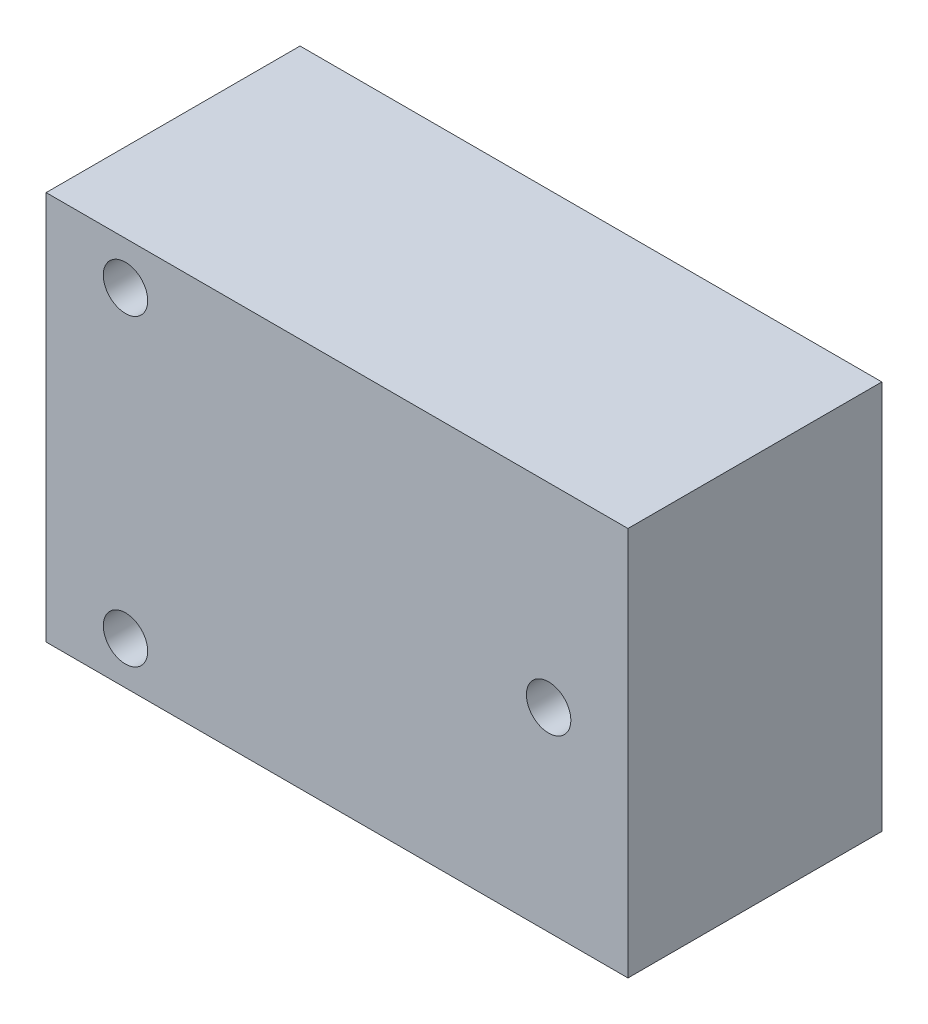
ISO-10303-21;
HEADER;
FILE_DESCRIPTION(('STEP AP214'),'2;1');
FILE_NAME('part.step','',(''),(''),'','','');
FILE_SCHEMA(('AUTOMOTIVE_DESIGN { 1 0 10303 214 1 1 1 1 }'));
ENDSEC;
DATA;
#1=APPLICATION_CONTEXT('core data for automotive mechanical design processes');
#2=APPLICATION_PROTOCOL_DEFINITION('international standard','automotive_design',2000,#1);
#3=PRODUCT_CONTEXT('',#1,'mechanical');
#4=PRODUCT('Part','Part','',(#3));
#5=PRODUCT_RELATED_PRODUCT_CATEGORY('part','',(#4));
#6=PRODUCT_DEFINITION_FORMATION('','',#4);
#7=PRODUCT_DEFINITION_CONTEXT('part definition',#1,'design');
#8=PRODUCT_DEFINITION('design','',#6,#7);
#9=PRODUCT_DEFINITION_SHAPE('','',#8);
#10=(LENGTH_UNIT() NAMED_UNIT(*) SI_UNIT(.MILLI.,.METRE.));
#11=(NAMED_UNIT(*) PLANE_ANGLE_UNIT() SI_UNIT($,.RADIAN.));
#12=(NAMED_UNIT(*) SI_UNIT($,.STERADIAN.) SOLID_ANGLE_UNIT());
#13=UNCERTAINTY_MEASURE_WITH_UNIT(LENGTH_MEASURE(1.E-05),#10,'distance_accuracy_value','');
#14=(GEOMETRIC_REPRESENTATION_CONTEXT(3) GLOBAL_UNCERTAINTY_ASSIGNED_CONTEXT((#13)) GLOBAL_UNIT_ASSIGNED_CONTEXT((#10,
#11,#12)) REPRESENTATION_CONTEXT('',''));
#15=CARTESIAN_POINT('',(0.,0.,0.));
#16=DIRECTION('',(0.,0.,1.));
#17=DIRECTION('',(1.,0.,0.));
#18=AXIS2_PLACEMENT_3D('',#15,#16,#17);
#19=CARTESIAN_POINT('',(0.,0.,24.));
#20=DIRECTION('',(0.,0.,-1.));
#21=DIRECTION('',(-1.,0.,0.));
#22=AXIS2_PLACEMENT_3D('',#19,#20,#21);
#23=PLANE('',#22);
#24=DIRECTION('',(0.,-1.,0.));
#25=VECTOR('',#24,1.);
#26=CARTESIAN_POINT('',(-27.5,18.4,24.));
#27=LINE('',#26,#25);
#28=CARTESIAN_POINT('',(-27.5,18.4,24.));
#29=VERTEX_POINT('',#28);
#30=CARTESIAN_POINT('',(-27.5,-18.4,24.));
#31=VERTEX_POINT('',#30);
#32=EDGE_CURVE('E92',#29,#31,#27,.T.);
#33=ORIENTED_EDGE('',*,*,#32,.T.);
#34=DIRECTION('',(1.,0.,0.));
#35=VECTOR('',#34,1.);
#36=CARTESIAN_POINT('',(27.5,-18.4,24.));
#37=LINE('',#36,#35);
#38=CARTESIAN_POINT('',(27.5,-18.4,24.));
#39=VERTEX_POINT('',#38);
#40=EDGE_CURVE('E87',#31,#39,#37,.T.);
#41=ORIENTED_EDGE('',*,*,#40,.T.);
#42=DIRECTION('',(0.,1.,0.));
#43=VECTOR('',#42,1.);
#44=CARTESIAN_POINT('',(27.5,18.4,24.));
#45=LINE('',#44,#43);
#46=CARTESIAN_POINT('',(27.5,18.4,24.));
#47=VERTEX_POINT('',#46);
#48=EDGE_CURVE('E90',#39,#47,#45,.T.);
#49=ORIENTED_EDGE('',*,*,#48,.T.);
#50=DIRECTION('',(-1.,0.,0.));
#51=VECTOR('',#50,1.);
#52=CARTESIAN_POINT('',(27.5,18.4,24.));
#53=LINE('',#52,#51);
#54=EDGE_CURVE('E57',#47,#29,#53,.T.);
#55=ORIENTED_EDGE('',*,*,#54,.T.);
#56=EDGE_LOOP('',(#33,#41,#49,#55));
#57=FACE_BOUND('',#56,.T.);
#58=CARTESIAN_POINT('',(-20.,14.35,24.));
#59=DIRECTION('',(0.,0.,1.));
#60=DIRECTION('',(1.,0.,0.));
#61=AXIS2_PLACEMENT_3D('',#58,#59,#60);
#62=CIRCLE('',#61,2.1);
#63=CARTESIAN_POINT('',(-17.9,14.35,24.));
#64=VERTEX_POINT('',#63);
#65=EDGE_CURVE('E112',#64,#64,#62,.T.);
#66=ORIENTED_EDGE('',*,*,#65,.F.);
#67=EDGE_LOOP('',(#66));
#68=FACE_BOUND('',#67,.T.);
#69=CARTESIAN_POINT('',(20.,0.,24.));
#70=DIRECTION('',(0.,0.,1.));
#71=DIRECTION('',(1.,0.,0.));
#72=AXIS2_PLACEMENT_3D('',#69,#70,#71);
#73=CIRCLE('',#72,2.1);
#74=CARTESIAN_POINT('',(22.1,0.,24.));
#75=VERTEX_POINT('',#74);
#76=EDGE_CURVE('E134',#75,#75,#73,.T.);
#77=ORIENTED_EDGE('',*,*,#76,.F.);
#78=EDGE_LOOP('',(#77));
#79=FACE_BOUND('',#78,.T.);
#80=CARTESIAN_POINT('',(-20.,-14.35,24.));
#81=DIRECTION('',(0.,0.,1.));
#82=DIRECTION('',(-1.,0.,0.));
#83=AXIS2_PLACEMENT_3D('',#80,#81,#82);
#84=CIRCLE('',#83,2.1);
#85=CARTESIAN_POINT('',(-22.1,-14.35,24.));
#86=VERTEX_POINT('',#85);
#87=EDGE_CURVE('E142',#86,#86,#84,.T.);
#88=ORIENTED_EDGE('',*,*,#87,.F.);
#89=EDGE_LOOP('',(#88));
#90=FACE_BOUND('',#89,.T.);
#91=ADVANCED_FACE('F39',(#57,#68,#79,#90),#23,.F.);
#92=CARTESIAN_POINT('',(0.,0.,0.));
#93=DIRECTION('',(0.,0.,-1.));
#94=DIRECTION('',(-1.,0.,0.));
#95=AXIS2_PLACEMENT_3D('',#92,#93,#94);
#96=PLANE('',#95);
#97=CARTESIAN_POINT('',(20.,0.,0.));
#98=DIRECTION('',(0.,0.,1.));
#99=DIRECTION('',(1.,0.,0.));
#100=AXIS2_PLACEMENT_3D('',#97,#98,#99);
#101=CIRCLE('',#100,2.1);
#102=CARTESIAN_POINT('',(22.1,0.,0.));
#103=VERTEX_POINT('',#102);
#104=EDGE_CURVE('E138',#103,#103,#101,.T.);
#105=ORIENTED_EDGE('',*,*,#104,.T.);
#106=EDGE_LOOP('',(#105));
#107=FACE_BOUND('',#106,.T.);
#108=DIRECTION('',(0.,-1.,0.));
#109=VECTOR('',#108,1.);
#110=CARTESIAN_POINT('',(-27.5,18.4,0.));
#111=LINE('',#110,#109);
#112=CARTESIAN_POINT('',(-27.5,18.4,0.));
#113=VERTEX_POINT('',#112);
#114=CARTESIAN_POINT('',(-27.5,-18.4,0.));
#115=VERTEX_POINT('',#114);
#116=EDGE_CURVE('E108',#113,#115,#111,.T.);
#117=ORIENTED_EDGE('',*,*,#116,.F.);
#118=DIRECTION('',(-1.,0.,0.));
#119=VECTOR('',#118,1.);
#120=CARTESIAN_POINT('',(27.5,18.4,0.));
#121=LINE('',#120,#119);
#122=CARTESIAN_POINT('',(27.5,18.4,0.));
#123=VERTEX_POINT('',#122);
#124=EDGE_CURVE('E80',#123,#113,#121,.T.);
#125=ORIENTED_EDGE('',*,*,#124,.F.);
#126=DIRECTION('',(0.,1.,0.));
#127=VECTOR('',#126,1.);
#128=CARTESIAN_POINT('',(27.5,18.4,0.));
#129=LINE('',#128,#127);
#130=CARTESIAN_POINT('',(27.5,-18.4,0.));
#131=VERTEX_POINT('',#130);
#132=EDGE_CURVE('E74',#131,#123,#129,.T.);
#133=ORIENTED_EDGE('',*,*,#132,.F.);
#134=DIRECTION('',(1.,0.,0.));
#135=VECTOR('',#134,1.);
#136=CARTESIAN_POINT('',(27.5,-18.4,0.));
#137=LINE('',#136,#135);
#138=EDGE_CURVE('E97',#115,#131,#137,.T.);
#139=ORIENTED_EDGE('',*,*,#138,.F.);
#140=EDGE_LOOP('',(#117,#125,#133,#139));
#141=FACE_BOUND('',#140,.T.);
#142=CARTESIAN_POINT('',(-20.,14.35,0.));
#143=DIRECTION('',(0.,0.,1.));
#144=DIRECTION('',(1.,0.,0.));
#145=AXIS2_PLACEMENT_3D('',#142,#143,#144);
#146=CIRCLE('',#145,2.1);
#147=CARTESIAN_POINT('',(-17.9,14.35,0.));
#148=VERTEX_POINT('',#147);
#149=EDGE_CURVE('E130',#148,#148,#146,.T.);
#150=ORIENTED_EDGE('',*,*,#149,.T.);
#151=EDGE_LOOP('',(#150));
#152=FACE_BOUND('',#151,.T.);
#153=CARTESIAN_POINT('',(-20.,-14.35,0.));
#154=DIRECTION('',(0.,0.,1.));
#155=DIRECTION('',(-1.,0.,0.));
#156=AXIS2_PLACEMENT_3D('',#153,#154,#155);
#157=CIRCLE('',#156,2.1);
#158=CARTESIAN_POINT('',(-22.1,-14.35,0.));
#159=VERTEX_POINT('',#158);
#160=EDGE_CURVE('E146',#159,#159,#157,.T.);
#161=ORIENTED_EDGE('',*,*,#160,.T.);
#162=EDGE_LOOP('',(#161));
#163=FACE_BOUND('',#162,.T.);
#164=ADVANCED_FACE('F125',(#107,#141,#152,#163),#96,.T.);
#165=CARTESIAN_POINT('',(-27.5,18.4,24.));
#166=DIRECTION('',(1.,0.,0.));
#167=DIRECTION('',(0.,1.,0.));
#168=AXIS2_PLACEMENT_3D('',#165,#166,#167);
#169=PLANE('',#168);
#170=ORIENTED_EDGE('',*,*,#116,.T.);
#171=DIRECTION('',(0.,0.,-1.));
#172=VECTOR('',#171,1.);
#173=CARTESIAN_POINT('',(-27.5,-18.4,24.));
#174=LINE('',#173,#172);
#175=EDGE_CURVE('E11',#31,#115,#174,.T.);
#176=ORIENTED_EDGE('',*,*,#175,.F.);
#177=ORIENTED_EDGE('',*,*,#32,.F.);
#178=DIRECTION('',(0.,0.,-1.));
#179=VECTOR('',#178,1.);
#180=CARTESIAN_POINT('',(-27.5,18.4,24.));
#181=LINE('',#180,#179);
#182=EDGE_CURVE('E104',#29,#113,#181,.T.);
#183=ORIENTED_EDGE('',*,*,#182,.T.);
#184=EDGE_LOOP('',(#170,#176,#177,#183));
#185=FACE_BOUND('',#184,.T.);
#186=ADVANCED_FACE('F41',(#185),#169,.F.);
#187=CARTESIAN_POINT('',(27.5,-18.4,24.));
#188=DIRECTION('',(0.,1.,0.));
#189=DIRECTION('',(-1.,0.,0.));
#190=AXIS2_PLACEMENT_3D('',#187,#188,#189);
#191=PLANE('',#190);
#192=ORIENTED_EDGE('',*,*,#138,.T.);
#193=DIRECTION('',(0.,0.,-1.));
#194=VECTOR('',#193,1.);
#195=CARTESIAN_POINT('',(27.5,-18.4,24.));
#196=LINE('',#195,#194);
#197=EDGE_CURVE('E49',#39,#131,#196,.T.);
#198=ORIENTED_EDGE('',*,*,#197,.F.);
#199=ORIENTED_EDGE('',*,*,#40,.F.);
#200=ORIENTED_EDGE('',*,*,#175,.T.);
#201=EDGE_LOOP('',(#192,#198,#199,#200));
#202=FACE_BOUND('',#201,.T.);
#203=ADVANCED_FACE('F96',(#202),#191,.F.);
#204=CARTESIAN_POINT('',(27.5,18.4,24.));
#205=DIRECTION('',(-1.,0.,0.));
#206=DIRECTION('',(0.,-1.,0.));
#207=AXIS2_PLACEMENT_3D('',#204,#205,#206);
#208=PLANE('',#207);
#209=ORIENTED_EDGE('',*,*,#132,.T.);
#210=DIRECTION('',(0.,0.,-1.));
#211=VECTOR('',#210,1.);
#212=CARTESIAN_POINT('',(27.5,18.4,24.));
#213=LINE('',#212,#211);
#214=EDGE_CURVE('E99',#47,#123,#213,.T.);
#215=ORIENTED_EDGE('',*,*,#214,.F.);
#216=ORIENTED_EDGE('',*,*,#48,.F.);
#217=ORIENTED_EDGE('',*,*,#197,.T.);
#218=EDGE_LOOP('',(#209,#215,#216,#217));
#219=FACE_BOUND('',#218,.T.);
#220=ADVANCED_FACE('F100',(#219),#208,.F.);
#221=CARTESIAN_POINT('',(27.5,18.4,24.));
#222=DIRECTION('',(0.,-1.,0.));
#223=DIRECTION('',(1.,0.,0.));
#224=AXIS2_PLACEMENT_3D('',#221,#222,#223);
#225=PLANE('',#224);
#226=ORIENTED_EDGE('',*,*,#124,.T.);
#227=ORIENTED_EDGE('',*,*,#182,.F.);
#228=ORIENTED_EDGE('',*,*,#54,.F.);
#229=ORIENTED_EDGE('',*,*,#214,.T.);
#230=EDGE_LOOP('',(#226,#227,#228,#229));
#231=FACE_BOUND('',#230,.T.);
#232=ADVANCED_FACE('F122',(#231),#225,.F.);
#233=CARTESIAN_POINT('',(-20.,14.35,24.));
#234=DIRECTION('',(0.,0.,-1.));
#235=DIRECTION('',(-1.,0.,0.));
#236=AXIS2_PLACEMENT_3D('',#233,#234,#235);
#237=CYLINDRICAL_SURFACE('',#236,2.1);
#238=ORIENTED_EDGE('',*,*,#65,.T.);
#239=EDGE_LOOP('',(#238));
#240=FACE_BOUND('',#239,.T.);
#241=ORIENTED_EDGE('',*,*,#149,.F.);
#242=EDGE_LOOP('',(#241));
#243=FACE_BOUND('',#242,.T.);
#244=ADVANCED_FACE('F165',(#240,#243),#237,.F.);
#245=CARTESIAN_POINT('',(20.,0.,24.));
#246=DIRECTION('',(0.,0.,-1.));
#247=DIRECTION('',(-1.,0.,0.));
#248=AXIS2_PLACEMENT_3D('',#245,#246,#247);
#249=CYLINDRICAL_SURFACE('',#248,2.1);
#250=ORIENTED_EDGE('',*,*,#76,.T.);
#251=EDGE_LOOP('',(#250));
#252=FACE_BOUND('',#251,.T.);
#253=ORIENTED_EDGE('',*,*,#104,.F.);
#254=EDGE_LOOP('',(#253));
#255=FACE_BOUND('',#254,.T.);
#256=ADVANCED_FACE('F211',(#252,#255),#249,.F.);
#257=CARTESIAN_POINT('',(-20.,-14.35,24.));
#258=DIRECTION('',(0.,0.,-1.));
#259=DIRECTION('',(-1.,0.,0.));
#260=AXIS2_PLACEMENT_3D('',#257,#258,#259);
#261=CYLINDRICAL_SURFACE('',#260,2.1);
#262=ORIENTED_EDGE('',*,*,#87,.T.);
#263=EDGE_LOOP('',(#262));
#264=FACE_BOUND('',#263,.T.);
#265=ORIENTED_EDGE('',*,*,#160,.F.);
#266=EDGE_LOOP('',(#265));
#267=FACE_BOUND('',#266,.T.);
#268=ADVANCED_FACE('F154',(#264,#267),#261,.F.);
#269=CLOSED_SHELL('',(#91,#164,#186,#203,#220,#232,#244,#256,#268));
#270=MANIFOLD_SOLID_BREP('B2',#269);
#271=ADVANCED_BREP_SHAPE_REPRESENTATION('',(#18,#270),#14);
#272=SHAPE_DEFINITION_REPRESENTATION(#9,#271);
ENDSEC;
END-ISO-10303-21;
